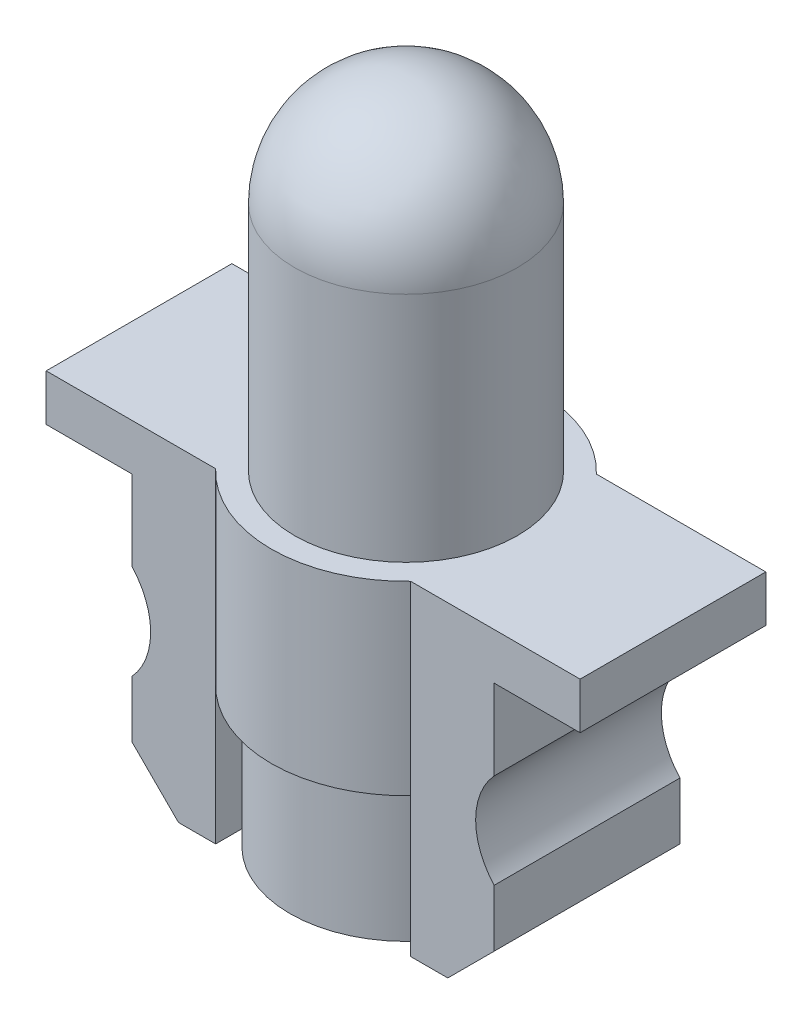
ISO-10303-21;
HEADER;
FILE_DESCRIPTION(('STEP AP214'),'2;1');
FILE_NAME('part.step','',(''),(''),'','','');
FILE_SCHEMA(('AUTOMOTIVE_DESIGN { 1 0 10303 214 1 1 1 1 }'));
ENDSEC;
DATA;
#1=APPLICATION_CONTEXT('core data for automotive mechanical design processes');
#2=APPLICATION_PROTOCOL_DEFINITION('international standard','automotive_design',2000,#1);
#3=PRODUCT_CONTEXT('',#1,'mechanical');
#4=PRODUCT('Part','Part','',(#3));
#5=PRODUCT_RELATED_PRODUCT_CATEGORY('part','',(#4));
#6=PRODUCT_DEFINITION_FORMATION('','',#4);
#7=PRODUCT_DEFINITION_CONTEXT('part definition',#1,'design');
#8=PRODUCT_DEFINITION('design','',#6,#7);
#9=PRODUCT_DEFINITION_SHAPE('','',#8);
#10=(LENGTH_UNIT() NAMED_UNIT(*) SI_UNIT(.MILLI.,.METRE.));
#11=(NAMED_UNIT(*) PLANE_ANGLE_UNIT() SI_UNIT($,.RADIAN.));
#12=(NAMED_UNIT(*) SI_UNIT($,.STERADIAN.) SOLID_ANGLE_UNIT());
#13=UNCERTAINTY_MEASURE_WITH_UNIT(LENGTH_MEASURE(1.E-05),#10,'distance_accuracy_value','');
#14=(GEOMETRIC_REPRESENTATION_CONTEXT(3) GLOBAL_UNCERTAINTY_ASSIGNED_CONTEXT((#13)) GLOBAL_UNIT_ASSIGNED_CONTEXT((#10,
#11,#12)) REPRESENTATION_CONTEXT('',''));
#15=CARTESIAN_POINT('',(0.,0.,0.));
#16=DIRECTION('',(0.,0.,1.));
#17=DIRECTION('',(1.,0.,0.));
#18=AXIS2_PLACEMENT_3D('',#15,#16,#17);
#19=CARTESIAN_POINT('',(3.9,-1.,-8.84105255059483));
#20=DIRECTION('',(1.,0.,0.));
#21=DIRECTION('',(0.,1.,0.));
#22=AXIS2_PLACEMENT_3D('',#19,#20,#21);
#23=PLANE('',#22);
#24=DIRECTION('',(0.,0.,1.));
#25=VECTOR('',#24,1.);
#26=CARTESIAN_POINT('',(3.9,-2.73019609728144,-2.9));
#27=LINE('',#26,#25);
#28=CARTESIAN_POINT('',(3.9,-2.73019609728144,-2.));
#29=VERTEX_POINT('',#28);
#30=CARTESIAN_POINT('',(3.9,-2.73019609728144,2.));
#31=VERTEX_POINT('',#30);
#32=EDGE_CURVE('E329',#29,#31,#27,.T.);
#33=ORIENTED_EDGE('',*,*,#32,.F.);
#34=DIRECTION('',(0.,1.,0.));
#35=VECTOR('',#34,1.);
#36=CARTESIAN_POINT('',(3.9,-1.,-2.));
#37=LINE('',#36,#35);
#38=CARTESIAN_POINT('',(3.9,-1.,-2.));
#39=VERTEX_POINT('',#38);
#40=EDGE_CURVE('E418',#29,#39,#37,.T.);
#41=ORIENTED_EDGE('',*,*,#40,.T.);
#42=DIRECTION('',(0.,0.,1.));
#43=VECTOR('',#42,1.);
#44=CARTESIAN_POINT('',(3.9,-1.,-8.84105255059483));
#45=LINE('',#44,#43);
#46=CARTESIAN_POINT('',(3.9,-1.,2.));
#47=VERTEX_POINT('',#46);
#48=EDGE_CURVE('E227',#39,#47,#45,.T.);
#49=ORIENTED_EDGE('',*,*,#48,.T.);
#50=DIRECTION('',(0.,1.,0.));
#51=VECTOR('',#50,1.);
#52=CARTESIAN_POINT('',(3.9,-1.,2.));
#53=LINE('',#52,#51);
#54=EDGE_CURVE('E419',#31,#47,#53,.T.);
#55=ORIENTED_EDGE('',*,*,#54,.F.);
#56=EDGE_LOOP('',(#33,#41,#49,#55));
#57=FACE_BOUND('',#56,.T.);
#58=ADVANCED_FACE('F36',(#57),#23,.T.);
#59=CARTESIAN_POINT('',(-3.9,-1.,-8.84105255059483));
#60=DIRECTION('',(-1.,0.,0.));
#61=DIRECTION('',(0.,-1.,0.));
#62=AXIS2_PLACEMENT_3D('',#59,#60,#61);
#63=PLANE('',#62);
#64=DIRECTION('',(0.,-1.,0.));
#65=VECTOR('',#64,1.);
#66=CARTESIAN_POINT('',(-3.9,-1.,-2.));
#67=LINE('',#66,#65);
#68=CARTESIAN_POINT('',(-3.9,-4.76980390271856,-2.));
#69=VERTEX_POINT('',#68);
#70=CARTESIAN_POINT('',(-3.9,-6.00000000000001,-2.));
#71=VERTEX_POINT('',#70);
#72=EDGE_CURVE('E244',#69,#71,#67,.T.);
#73=ORIENTED_EDGE('',*,*,#72,.T.);
#74=DIRECTION('',(0.,0.,1.));
#75=VECTOR('',#74,1.);
#76=CARTESIAN_POINT('',(-3.9,-6.,2.));
#77=LINE('',#76,#75);
#78=CARTESIAN_POINT('',(-3.9,-6.00000000000001,2.));
#79=VERTEX_POINT('',#78);
#80=EDGE_CURVE('E342',#71,#79,#77,.T.);
#81=ORIENTED_EDGE('',*,*,#80,.T.);
#82=DIRECTION('',(0.,-1.,0.));
#83=VECTOR('',#82,1.);
#84=CARTESIAN_POINT('',(-3.9,-1.,2.));
#85=LINE('',#84,#83);
#86=CARTESIAN_POINT('',(-3.9,-4.76980390271856,2.));
#87=VERTEX_POINT('',#86);
#88=EDGE_CURVE('E239',#87,#79,#85,.T.);
#89=ORIENTED_EDGE('',*,*,#88,.F.);
#90=DIRECTION('',(0.,0.,1.));
#91=VECTOR('',#90,1.);
#92=CARTESIAN_POINT('',(-3.9,-4.76980390271856,-2.9));
#93=LINE('',#92,#91);
#94=EDGE_CURVE('E324',#69,#87,#93,.T.);
#95=ORIENTED_EDGE('',*,*,#94,.F.);
#96=EDGE_LOOP('',(#73,#81,#89,#95));
#97=FACE_BOUND('',#96,.T.);
#98=ADVANCED_FACE('F357',(#97),#63,.T.);
#99=CARTESIAN_POINT('',(0.,-4.,0.));
#100=DIRECTION('',(0.,1.,0.));
#101=DIRECTION('',(0.,0.,1.));
#102=AXIS2_PLACEMENT_3D('',#99,#100,#101);
#103=PLANE('',#102);
#104=CARTESIAN_POINT('',(0.,-4.,0.));
#105=DIRECTION('',(0.,1.,0.));
#106=DIRECTION('',(0.,0.,1.));
#107=AXIS2_PLACEMENT_3D('',#104,#105,#106);
#108=CIRCLE('',#107,2.9);
#109=CARTESIAN_POINT('',(2.1,-4.,-2.));
#110=VERTEX_POINT('',#109);
#111=CARTESIAN_POINT('',(-2.1,-4.,-2.));
#112=VERTEX_POINT('',#111);
#113=EDGE_CURVE('E265',#110,#112,#108,.T.);
#114=ORIENTED_EDGE('',*,*,#113,.F.);
#115=DIRECTION('',(0.,0.,1.));
#116=VECTOR('',#115,1.);
#117=CARTESIAN_POINT('',(2.1,-4.,0.));
#118=LINE('',#117,#116);
#119=CARTESIAN_POINT('',(2.1,-4.,-1.35646599662505));
#120=VERTEX_POINT('',#119);
#121=EDGE_CURVE('E222',#110,#120,#118,.T.);
#122=ORIENTED_EDGE('',*,*,#121,.T.);
#123=CARTESIAN_POINT('',(0.,-4.,0.));
#124=DIRECTION('',(0.,1.,0.));
#125=DIRECTION('',(0.,0.,1.));
#126=AXIS2_PLACEMENT_3D('',#123,#124,#125);
#127=CIRCLE('',#126,2.5);
#128=CARTESIAN_POINT('',(-2.1,-4.,-1.35646599662506));
#129=VERTEX_POINT('',#128);
#130=EDGE_CURVE('E221',#129,#120,#127,.F.);
#131=ORIENTED_EDGE('',*,*,#130,.F.);
#132=DIRECTION('',(0.,0.,-1.));
#133=VECTOR('',#132,1.);
#134=CARTESIAN_POINT('',(-2.1,-4.,0.));
#135=LINE('',#134,#133);
#136=EDGE_CURVE('E255',#129,#112,#135,.T.);
#137=ORIENTED_EDGE('',*,*,#136,.T.);
#138=EDGE_LOOP('',(#114,#122,#131,#137));
#139=FACE_BOUND('',#138,.T.);
#140=ADVANCED_FACE('F394',(#139),#103,.F.);
#141=CARTESIAN_POINT('',(0.,-4.,0.));
#142=DIRECTION('',(0.,1.,0.));
#143=DIRECTION('',(0.,0.,1.));
#144=AXIS2_PLACEMENT_3D('',#141,#142,#143);
#145=CYLINDRICAL_SURFACE('',#144,2.9);
#146=DIRECTION('',(0.,1.,0.));
#147=VECTOR('',#146,1.);
#148=CARTESIAN_POINT('',(2.1,-4.,-2.));
#149=LINE('',#148,#147);
#150=CARTESIAN_POINT('',(2.1,0.,-2.));
#151=VERTEX_POINT('',#150);
#152=EDGE_CURVE('E277',#151,#110,#149,.F.);
#153=ORIENTED_EDGE('',*,*,#152,.T.);
#154=ORIENTED_EDGE('',*,*,#113,.T.);
#155=DIRECTION('',(0.,1.,0.));
#156=VECTOR('',#155,1.);
#157=CARTESIAN_POINT('',(-2.1,-4.,-2.));
#158=LINE('',#157,#156);
#159=CARTESIAN_POINT('',(-2.1,0.,-2.));
#160=VERTEX_POINT('',#159);
#161=EDGE_CURVE('E271',#112,#160,#158,.T.);
#162=ORIENTED_EDGE('',*,*,#161,.T.);
#163=CARTESIAN_POINT('',(0.,0.,0.));
#164=DIRECTION('',(0.,1.,0.));
#165=DIRECTION('',(0.,0.,1.));
#166=AXIS2_PLACEMENT_3D('',#163,#164,#165);
#167=CIRCLE('',#166,2.9);
#168=EDGE_CURVE('E268',#151,#160,#167,.T.);
#169=ORIENTED_EDGE('',*,*,#168,.F.);
#170=EDGE_LOOP('',(#153,#154,#162,#169));
#171=FACE_BOUND('',#170,.T.);
#172=ADVANCED_FACE('F391',(#171),#145,.T.);
#173=CARTESIAN_POINT('',(0.,-7.6,0.));
#174=DIRECTION('',(0.,1.,0.));
#175=DIRECTION('',(0.,0.,1.));
#176=AXIS2_PLACEMENT_3D('',#173,#174,#175);
#177=CYLINDRICAL_SURFACE('',#176,2.5);
#178=DIRECTION('',(0.,1.,0.));
#179=VECTOR('',#178,1.);
#180=CARTESIAN_POINT('',(-2.1,-7.6,1.35646599662506));
#181=LINE('',#180,#179);
#182=CARTESIAN_POINT('',(-2.1,-4.,1.35646599662506));
#183=VERTEX_POINT('',#182);
#184=CARTESIAN_POINT('',(-2.1,-7.,1.35646599662506));
#185=VERTEX_POINT('',#184);
#186=EDGE_CURVE('E243',#183,#185,#181,.F.);
#187=ORIENTED_EDGE('',*,*,#186,.T.);
#188=CARTESIAN_POINT('',(0.,-7.,0.));
#189=DIRECTION('',(0.,1.,0.));
#190=DIRECTION('',(0.,0.,1.));
#191=AXIS2_PLACEMENT_3D('',#188,#189,#190);
#192=CIRCLE('',#191,2.5);
#193=CARTESIAN_POINT('',(2.1,-7.,1.35646599662505));
#194=VERTEX_POINT('',#193);
#195=EDGE_CURVE('E407',#185,#194,#192,.T.);
#196=ORIENTED_EDGE('',*,*,#195,.T.);
#197=DIRECTION('',(0.,1.,0.));
#198=VECTOR('',#197,1.);
#199=CARTESIAN_POINT('',(2.1,-7.6,1.35646599662505));
#200=LINE('',#199,#198);
#201=CARTESIAN_POINT('',(2.1,-4.,1.35646599662505));
#202=VERTEX_POINT('',#201);
#203=EDGE_CURVE('E224',#194,#202,#200,.T.);
#204=ORIENTED_EDGE('',*,*,#203,.T.);
#205=EDGE_CURVE('E320',#202,#183,#127,.F.);
#206=ORIENTED_EDGE('',*,*,#205,.T.);
#207=EDGE_LOOP('',(#187,#196,#204,#206));
#208=FACE_BOUND('',#207,.T.);
#209=ADVANCED_FACE('F475',(#208),#177,.T.);
#210=ORIENTED_EDGE('',*,*,#205,.F.);
#211=CARTESIAN_POINT('',(2.1,-4.,2.));
#212=VERTEX_POINT('',#211);
#213=EDGE_CURVE('E226',#202,#212,#118,.T.);
#214=ORIENTED_EDGE('',*,*,#213,.T.);
#215=CARTESIAN_POINT('',(-2.1,-4.,2.));
#216=VERTEX_POINT('',#215);
#217=EDGE_CURVE('E261',#216,#212,#108,.T.);
#218=ORIENTED_EDGE('',*,*,#217,.F.);
#219=EDGE_CURVE('E251',#216,#183,#135,.T.);
#220=ORIENTED_EDGE('',*,*,#219,.T.);
#221=EDGE_LOOP('',(#210,#214,#218,#220));
#222=FACE_BOUND('',#221,.T.);
#223=ADVANCED_FACE('F467',(#222),#103,.F.);
#224=CARTESIAN_POINT('',(-5.75,0.,-2.));
#225=DIRECTION('',(0.,-1.,0.));
#226=DIRECTION('',(0.,0.,-1.));
#227=AXIS2_PLACEMENT_3D('',#224,#225,#226);
#228=PLANE('',#227);
#229=DIRECTION('',(1.,0.,0.));
#230=VECTOR('',#229,1.);
#231=CARTESIAN_POINT('',(-5.75,0.,2.));
#232=LINE('',#231,#230);
#233=CARTESIAN_POINT('',(-5.75,0.,2.));
#234=VERTEX_POINT('',#233);
#235=CARTESIAN_POINT('',(-2.1,0.,2.));
#236=VERTEX_POINT('',#235);
#237=EDGE_CURVE('E299',#234,#236,#232,.T.);
#238=ORIENTED_EDGE('',*,*,#237,.T.);
#239=CARTESIAN_POINT('',(2.1,0.,2.));
#240=VERTEX_POINT('',#239);
#241=EDGE_CURVE('E260',#236,#240,#167,.T.);
#242=ORIENTED_EDGE('',*,*,#241,.T.);
#243=CARTESIAN_POINT('',(5.75,0.,2.));
#244=VERTEX_POINT('',#243);
#245=EDGE_CURVE('E298',#240,#244,#232,.T.);
#246=ORIENTED_EDGE('',*,*,#245,.T.);
#247=DIRECTION('',(0.,0.,-1.));
#248=VECTOR('',#247,1.);
#249=CARTESIAN_POINT('',(5.75,0.,2.));
#250=LINE('',#249,#248);
#251=CARTESIAN_POINT('',(5.75,0.,-2.));
#252=VERTEX_POINT('',#251);
#253=EDGE_CURVE('E302',#244,#252,#250,.T.);
#254=ORIENTED_EDGE('',*,*,#253,.T.);
#255=DIRECTION('',(-1.,0.,0.));
#256=VECTOR('',#255,1.);
#257=CARTESIAN_POINT('',(-5.75,0.,-2.));
#258=LINE('',#257,#256);
#259=EDGE_CURVE('E284',#252,#151,#258,.T.);
#260=ORIENTED_EDGE('',*,*,#259,.T.);
#261=ORIENTED_EDGE('',*,*,#168,.T.);
#262=CARTESIAN_POINT('',(-5.75,0.,-2.));
#263=VERTEX_POINT('',#262);
#264=EDGE_CURVE('E305',#160,#263,#258,.T.);
#265=ORIENTED_EDGE('',*,*,#264,.T.);
#266=DIRECTION('',(0.,0.,1.));
#267=VECTOR('',#266,1.);
#268=CARTESIAN_POINT('',(-5.75,0.,2.));
#269=LINE('',#268,#267);
#270=EDGE_CURVE('E279',#263,#234,#269,.T.);
#271=ORIENTED_EDGE('',*,*,#270,.T.);
#272=EDGE_LOOP('',(#238,#242,#246,#254,#260,#261,#265,#271));
#273=FACE_BOUND('',#272,.T.);
#274=CARTESIAN_POINT('',(0.,0.,0.));
#275=DIRECTION('',(0.,-1.,0.));
#276=DIRECTION('',(0.,0.,-1.));
#277=AXIS2_PLACEMENT_3D('',#274,#275,#276);
#278=CIRCLE('',#277,2.4);
#279=CARTESIAN_POINT('',(0.,0.,-2.4));
#280=VERTEX_POINT('',#279);
#281=EDGE_CURVE('E311',#280,#280,#278,.F.);
#282=ORIENTED_EDGE('',*,*,#281,.F.);
#283=EDGE_LOOP('',(#282));
#284=FACE_BOUND('',#283,.T.);
#285=ADVANCED_FACE('F381',(#273,#284),#228,.F.);
#286=CARTESIAN_POINT('',(-5.75,-1.,-2.));
#287=DIRECTION('',(0.,0.,-1.));
#288=DIRECTION('',(-1.,0.,0.));
#289=AXIS2_PLACEMENT_3D('',#286,#287,#288);
#290=PLANE('',#289);
#291=DIRECTION('',(1.,0.,0.));
#292=VECTOR('',#291,1.);
#293=CARTESIAN_POINT('',(-5.75,-7.,-2.));
#294=LINE('',#293,#292);
#295=CARTESIAN_POINT('',(-2.9,-7.,-2.));
#296=VERTEX_POINT('',#295);
#297=CARTESIAN_POINT('',(-2.1,-7.,-2.));
#298=VERTEX_POINT('',#297);
#299=EDGE_CURVE('E398',#296,#298,#294,.T.);
#300=ORIENTED_EDGE('',*,*,#299,.F.);
#301=DIRECTION('',(-0.707106781186549,0.707106781186546,0.));
#302=VECTOR('',#301,1.);
#303=CARTESIAN_POINT('',(-7.32500000000001,-2.57500000000001,-2.));
#304=LINE('',#303,#302);
#305=EDGE_CURVE('E11',#296,#71,#304,.T.);
#306=ORIENTED_EDGE('',*,*,#305,.T.);
#307=ORIENTED_EDGE('',*,*,#72,.F.);
#308=CARTESIAN_POINT('',(-5.,-3.75,-2.));
#309=DIRECTION('',(0.,0.,-1.));
#310=DIRECTION('',(-1.,0.,0.));
#311=AXIS2_PLACEMENT_3D('',#308,#309,#310);
#312=CIRCLE('',#311,1.5);
#313=CARTESIAN_POINT('',(-3.9,-2.73019609728144,-2.));
#314=VERTEX_POINT('',#313);
#315=EDGE_CURVE('E361',#314,#69,#312,.T.);
#316=ORIENTED_EDGE('',*,*,#315,.F.);
#317=CARTESIAN_POINT('',(-3.9,-1.,-2.));
#318=VERTEX_POINT('',#317);
#319=EDGE_CURVE('E240',#318,#314,#67,.T.);
#320=ORIENTED_EDGE('',*,*,#319,.F.);
#321=DIRECTION('',(-1.,0.,0.));
#322=VECTOR('',#321,1.);
#323=CARTESIAN_POINT('',(-5.75,-1.,-2.));
#324=LINE('',#323,#322);
#325=CARTESIAN_POINT('',(-5.75,-1.,-2.));
#326=VERTEX_POINT('',#325);
#327=EDGE_CURVE('E291',#318,#326,#324,.T.);
#328=ORIENTED_EDGE('',*,*,#327,.T.);
#329=DIRECTION('',(0.,1.,0.));
#330=VECTOR('',#329,1.);
#331=CARTESIAN_POINT('',(-5.75,-1.,-2.));
#332=LINE('',#331,#330);
#333=EDGE_CURVE('E308',#326,#263,#332,.T.);
#334=ORIENTED_EDGE('',*,*,#333,.T.);
#335=ORIENTED_EDGE('',*,*,#264,.F.);
#336=ORIENTED_EDGE('',*,*,#161,.F.);
#337=DIRECTION('',(0.,1.,0.));
#338=VECTOR('',#337,1.);
#339=CARTESIAN_POINT('',(-2.1,-1.,-2.));
#340=LINE('',#339,#338);
#341=EDGE_CURVE('E235',#298,#112,#340,.T.);
#342=ORIENTED_EDGE('',*,*,#341,.F.);
#343=EDGE_LOOP('',(#300,#306,#307,#316,#320,#328,#334,#335,#336,#342));
#344=FACE_BOUND('',#343,.T.);
#345=ADVANCED_FACE('F360',(#344),#290,.T.);
#346=CARTESIAN_POINT('',(-5.75,-1.,2.));
#347=DIRECTION('',(0.,0.,1.));
#348=DIRECTION('',(1.,0.,0.));
#349=AXIS2_PLACEMENT_3D('',#346,#347,#348);
#350=PLANE('',#349);
#351=DIRECTION('',(-1.,0.,0.));
#352=VECTOR('',#351,1.);
#353=CARTESIAN_POINT('',(-5.75,-7.,2.));
#354=LINE('',#353,#352);
#355=CARTESIAN_POINT('',(2.9,-7.,2.));
#356=VERTEX_POINT('',#355);
#357=CARTESIAN_POINT('',(2.1,-7.,2.));
#358=VERTEX_POINT('',#357);
#359=EDGE_CURVE('E401',#356,#358,#354,.T.);
#360=ORIENTED_EDGE('',*,*,#359,.F.);
#361=DIRECTION('',(0.707106781186546,0.707106781186549,0.));
#362=VECTOR('',#361,1.);
#363=CARTESIAN_POINT('',(1.57500000000002,-8.32499999999999,2.));
#364=LINE('',#363,#362);
#365=CARTESIAN_POINT('',(3.9,-6.,2.));
#366=VERTEX_POINT('',#365);
#367=EDGE_CURVE('E336',#356,#366,#364,.T.);
#368=ORIENTED_EDGE('',*,*,#367,.T.);
#369=CARTESIAN_POINT('',(3.9,-4.76980390271856,2.));
#370=VERTEX_POINT('',#369);
#371=EDGE_CURVE('E416',#366,#370,#53,.T.);
#372=ORIENTED_EDGE('',*,*,#371,.T.);
#373=CARTESIAN_POINT('',(5.,-3.75,2.));
#374=DIRECTION('',(0.,0.,1.));
#375=DIRECTION('',(1.,0.,0.));
#376=AXIS2_PLACEMENT_3D('',#373,#374,#375);
#377=CIRCLE('',#376,1.5);
#378=EDGE_CURVE('E412',#31,#370,#377,.T.);
#379=ORIENTED_EDGE('',*,*,#378,.F.);
#380=ORIENTED_EDGE('',*,*,#54,.T.);
#381=DIRECTION('',(1.,0.,0.));
#382=VECTOR('',#381,1.);
#383=CARTESIAN_POINT('',(-5.75,-1.,2.));
#384=LINE('',#383,#382);
#385=CARTESIAN_POINT('',(5.75,-1.,2.));
#386=VERTEX_POINT('',#385);
#387=EDGE_CURVE('E283',#47,#386,#384,.T.);
#388=ORIENTED_EDGE('',*,*,#387,.T.);
#389=DIRECTION('',(0.,1.,0.));
#390=VECTOR('',#389,1.);
#391=CARTESIAN_POINT('',(5.75,-1.,2.));
#392=LINE('',#391,#390);
#393=EDGE_CURVE('E314',#386,#244,#392,.T.);
#394=ORIENTED_EDGE('',*,*,#393,.T.);
#395=ORIENTED_EDGE('',*,*,#245,.F.);
#396=DIRECTION('',(0.,1.,0.));
#397=VECTOR('',#396,1.);
#398=CARTESIAN_POINT('',(2.1,-4.,2.));
#399=LINE('',#398,#397);
#400=EDGE_CURVE('E274',#212,#240,#399,.T.);
#401=ORIENTED_EDGE('',*,*,#400,.F.);
#402=DIRECTION('',(0.,-1.,0.));
#403=VECTOR('',#402,1.);
#404=CARTESIAN_POINT('',(2.1,-1.,2.));
#405=LINE('',#404,#403);
#406=EDGE_CURVE('E364',#212,#358,#405,.T.);
#407=ORIENTED_EDGE('',*,*,#406,.T.);
#408=EDGE_LOOP('',(#360,#368,#372,#379,#380,#388,#394,#395,#401,#407));
#409=FACE_BOUND('',#408,.T.);
#410=ADVANCED_FACE('F446',(#409),#350,.T.);
#411=CARTESIAN_POINT('',(-5.75,-1.,-2.));
#412=DIRECTION('',(0.,-1.,0.));
#413=DIRECTION('',(0.,0.,-1.));
#414=AXIS2_PLACEMENT_3D('',#411,#412,#413);
#415=PLANE('',#414);
#416=ORIENTED_EDGE('',*,*,#48,.F.);
#417=CARTESIAN_POINT('',(5.75,-1.,-2.));
#418=VERTEX_POINT('',#417);
#419=EDGE_CURVE('E292',#418,#39,#324,.T.);
#420=ORIENTED_EDGE('',*,*,#419,.F.);
#421=DIRECTION('',(0.,0.,-1.));
#422=VECTOR('',#421,1.);
#423=CARTESIAN_POINT('',(5.75,-1.,2.));
#424=LINE('',#423,#422);
#425=EDGE_CURVE('E288',#386,#418,#424,.T.);
#426=ORIENTED_EDGE('',*,*,#425,.F.);
#427=ORIENTED_EDGE('',*,*,#387,.F.);
#428=EDGE_LOOP('',(#416,#420,#426,#427));
#429=FACE_BOUND('',#428,.T.);
#430=ADVANCED_FACE('F436',(#429),#415,.T.);
#431=CARTESIAN_POINT('',(-5.75,-1.,2.));
#432=DIRECTION('',(-1.,0.,0.));
#433=DIRECTION('',(0.,0.,1.));
#434=AXIS2_PLACEMENT_3D('',#431,#432,#433);
#435=PLANE('',#434);
#436=ORIENTED_EDGE('',*,*,#270,.F.);
#437=ORIENTED_EDGE('',*,*,#333,.F.);
#438=DIRECTION('',(0.,0.,1.));
#439=VECTOR('',#438,1.);
#440=CARTESIAN_POINT('',(-5.75,-1.,2.));
#441=LINE('',#440,#439);
#442=CARTESIAN_POINT('',(-5.75,-1.,2.));
#443=VERTEX_POINT('',#442);
#444=EDGE_CURVE('E280',#326,#443,#441,.T.);
#445=ORIENTED_EDGE('',*,*,#444,.T.);
#446=DIRECTION('',(0.,1.,0.));
#447=VECTOR('',#446,1.);
#448=CARTESIAN_POINT('',(-5.75,-1.,2.));
#449=LINE('',#448,#447);
#450=EDGE_CURVE('E295',#443,#234,#449,.T.);
#451=ORIENTED_EDGE('',*,*,#450,.T.);
#452=EDGE_LOOP('',(#436,#437,#445,#451));
#453=FACE_BOUND('',#452,.T.);
#454=ADVANCED_FACE('F378',(#453),#435,.T.);
#455=CARTESIAN_POINT('',(3.9,-5.99999999999999,-2.));
#456=VERTEX_POINT('',#455);
#457=CARTESIAN_POINT('',(3.9,-4.76980390271856,-2.));
#458=VERTEX_POINT('',#457);
#459=EDGE_CURVE('E421',#456,#458,#37,.T.);
#460=ORIENTED_EDGE('',*,*,#459,.F.);
#461=DIRECTION('',(-0.707106781186546,-0.707106781186549,0.));
#462=VECTOR('',#461,1.);
#463=CARTESIAN_POINT('',(1.57500000000002,-8.32499999999999,-2.));
#464=LINE('',#463,#462);
#465=CARTESIAN_POINT('',(2.9,-7.,-2.));
#466=VERTEX_POINT('',#465);
#467=EDGE_CURVE('E340',#456,#466,#464,.T.);
#468=ORIENTED_EDGE('',*,*,#467,.T.);
#469=DIRECTION('',(1.,0.,0.));
#470=VECTOR('',#469,1.);
#471=CARTESIAN_POINT('',(-5.75,-7.,-2.));
#472=LINE('',#471,#470);
#473=CARTESIAN_POINT('',(2.1,-7.,-2.));
#474=VERTEX_POINT('',#473);
#475=EDGE_CURVE('E207',#474,#466,#472,.T.);
#476=ORIENTED_EDGE('',*,*,#475,.F.);
#477=DIRECTION('',(0.,-1.,0.));
#478=VECTOR('',#477,1.);
#479=CARTESIAN_POINT('',(2.1,-1.,-2.));
#480=LINE('',#479,#478);
#481=EDGE_CURVE('E216',#110,#474,#480,.T.);
#482=ORIENTED_EDGE('',*,*,#481,.F.);
#483=ORIENTED_EDGE('',*,*,#152,.F.);
#484=ORIENTED_EDGE('',*,*,#259,.F.);
#485=DIRECTION('',(0.,1.,0.));
#486=VECTOR('',#485,1.);
#487=CARTESIAN_POINT('',(5.75,-1.,-2.));
#488=LINE('',#487,#486);
#489=EDGE_CURVE('E312',#418,#252,#488,.T.);
#490=ORIENTED_EDGE('',*,*,#489,.F.);
#491=ORIENTED_EDGE('',*,*,#419,.T.);
#492=ORIENTED_EDGE('',*,*,#40,.F.);
#493=CARTESIAN_POINT('',(5.,-3.75,-2.));
#494=DIRECTION('',(0.,0.,-1.));
#495=DIRECTION('',(-1.,0.,0.));
#496=AXIS2_PLACEMENT_3D('',#493,#494,#495);
#497=CIRCLE('',#496,1.5);
#498=EDGE_CURVE('E354',#458,#29,#497,.T.);
#499=ORIENTED_EDGE('',*,*,#498,.F.);
#500=EDGE_LOOP('',(#460,#468,#476,#482,#483,#484,#490,#491,#492,#499));
#501=FACE_BOUND('',#500,.T.);
#502=ADVANCED_FACE('F438',(#501),#290,.T.);
#503=CARTESIAN_POINT('',(5.75,-1.,2.));
#504=DIRECTION('',(1.,0.,0.));
#505=DIRECTION('',(0.,0.,-1.));
#506=AXIS2_PLACEMENT_3D('',#503,#504,#505);
#507=PLANE('',#506);
#508=ORIENTED_EDGE('',*,*,#253,.F.);
#509=ORIENTED_EDGE('',*,*,#393,.F.);
#510=ORIENTED_EDGE('',*,*,#425,.T.);
#511=ORIENTED_EDGE('',*,*,#489,.T.);
#512=EDGE_LOOP('',(#508,#509,#510,#511));
#513=FACE_BOUND('',#512,.T.);
#514=ADVANCED_FACE('F443',(#513),#507,.T.);
#515=ORIENTED_EDGE('',*,*,#88,.T.);
#516=DIRECTION('',(0.707106781186549,-0.707106781186546,0.));
#517=VECTOR('',#516,1.);
#518=CARTESIAN_POINT('',(-7.32500000000001,-2.57500000000001,2.));
#519=LINE('',#518,#517);
#520=CARTESIAN_POINT('',(-2.9,-7.,2.));
#521=VERTEX_POINT('',#520);
#522=EDGE_CURVE('E44',#79,#521,#519,.T.);
#523=ORIENTED_EDGE('',*,*,#522,.T.);
#524=DIRECTION('',(-1.,0.,0.));
#525=VECTOR('',#524,1.);
#526=CARTESIAN_POINT('',(-5.75,-7.,2.));
#527=LINE('',#526,#525);
#528=CARTESIAN_POINT('',(-2.1,-7.,2.));
#529=VERTEX_POINT('',#528);
#530=EDGE_CURVE('E348',#529,#521,#527,.T.);
#531=ORIENTED_EDGE('',*,*,#530,.F.);
#532=DIRECTION('',(0.,1.,0.));
#533=VECTOR('',#532,1.);
#534=CARTESIAN_POINT('',(-2.1,-1.,2.));
#535=LINE('',#534,#533);
#536=EDGE_CURVE('E233',#529,#216,#535,.T.);
#537=ORIENTED_EDGE('',*,*,#536,.T.);
#538=DIRECTION('',(0.,1.,0.));
#539=VECTOR('',#538,1.);
#540=CARTESIAN_POINT('',(-2.1,-4.,2.));
#541=LINE('',#540,#539);
#542=EDGE_CURVE('E264',#236,#216,#541,.F.);
#543=ORIENTED_EDGE('',*,*,#542,.F.);
#544=ORIENTED_EDGE('',*,*,#237,.F.);
#545=ORIENTED_EDGE('',*,*,#450,.F.);
#546=CARTESIAN_POINT('',(-3.9,-1.,2.));
#547=VERTEX_POINT('',#546);
#548=EDGE_CURVE('E285',#443,#547,#384,.T.);
#549=ORIENTED_EDGE('',*,*,#548,.T.);
#550=CARTESIAN_POINT('',(-3.9,-2.73019609728144,2.));
#551=VERTEX_POINT('',#550);
#552=EDGE_CURVE('E236',#547,#551,#85,.T.);
#553=ORIENTED_EDGE('',*,*,#552,.T.);
#554=CARTESIAN_POINT('',(-5.,-3.75,2.));
#555=DIRECTION('',(0.,0.,1.));
#556=DIRECTION('',(1.,0.,0.));
#557=AXIS2_PLACEMENT_3D('',#554,#555,#556);
#558=CIRCLE('',#557,1.5);
#559=EDGE_CURVE('E365',#87,#551,#558,.T.);
#560=ORIENTED_EDGE('',*,*,#559,.F.);
#561=EDGE_LOOP('',(#515,#523,#531,#537,#543,#544,#545,#549,#553,#560));
#562=FACE_BOUND('',#561,.T.);
#563=ADVANCED_FACE('F347',(#562),#350,.T.);
#564=DIRECTION('',(0.,0.,1.));
#565=VECTOR('',#564,1.);
#566=CARTESIAN_POINT('',(-3.9,-1.,-8.84105255059483));
#567=LINE('',#566,#565);
#568=EDGE_CURVE('E246',#318,#547,#567,.T.);
#569=ORIENTED_EDGE('',*,*,#568,.T.);
#570=ORIENTED_EDGE('',*,*,#548,.F.);
#571=ORIENTED_EDGE('',*,*,#444,.F.);
#572=ORIENTED_EDGE('',*,*,#327,.F.);
#573=EDGE_LOOP('',(#569,#570,#571,#572));
#574=FACE_BOUND('',#573,.T.);
#575=ADVANCED_FACE('F374',(#574),#415,.T.);
#576=ORIENTED_EDGE('',*,*,#217,.T.);
#577=ORIENTED_EDGE('',*,*,#400,.T.);
#578=ORIENTED_EDGE('',*,*,#241,.F.);
#579=ORIENTED_EDGE('',*,*,#542,.T.);
#580=EDGE_LOOP('',(#576,#577,#578,#579));
#581=FACE_BOUND('',#580,.T.);
#582=ADVANCED_FACE('F469',(#581),#145,.T.);
#583=CARTESIAN_POINT('',(0.,7.94580611308462,0.));
#584=DIRECTION('',(0.,1.,0.));
#585=DIRECTION('',(0.,0.,1.));
#586=AXIS2_PLACEMENT_3D('',#583,#584,#585);
#587=CYLINDRICAL_SURFACE('',#586,2.4);
#588=CARTESIAN_POINT('',(0.,5.,0.));
#589=DIRECTION('',(0.,1.,0.));
#590=DIRECTION('',(0.,0.,1.));
#591=AXIS2_PLACEMENT_3D('',#588,#589,#590);
#592=CIRCLE('',#591,2.4);
#593=CARTESIAN_POINT('',(0.,5.,2.4));
#594=VERTEX_POINT('',#593);
#595=EDGE_CURVE('E257',#594,#594,#592,.T.);
#596=ORIENTED_EDGE('',*,*,#595,.F.);
#597=EDGE_LOOP('',(#596));
#598=FACE_BOUND('',#597,.T.);
#599=ORIENTED_EDGE('',*,*,#281,.T.);
#600=EDGE_LOOP('',(#599));
#601=FACE_BOUND('',#600,.T.);
#602=ADVANCED_FACE('F528',(#598,#601),#587,.T.);
#603=CARTESIAN_POINT('',(0.,5.,0.));
#604=DIRECTION('',(0.,1.,0.));
#605=DIRECTION('',(1.,0.,0.));
#606=AXIS2_PLACEMENT_3D('',#603,#604,#605);
#607=SPHERICAL_SURFACE('',#606,2.4);
#608=ORIENTED_EDGE('',*,*,#595,.T.);
#609=EDGE_LOOP('',(#608));
#610=FACE_BOUND('',#609,.T.);
#611=ADVANCED_FACE('F487',(#610),#607,.T.);
#612=DIRECTION('',(0.,1.,0.));
#613=VECTOR('',#612,1.);
#614=CARTESIAN_POINT('',(2.1,-7.6,-1.35646599662505));
#615=LINE('',#614,#613);
#616=CARTESIAN_POINT('',(2.1,-7.,-1.35646599662505));
#617=VERTEX_POINT('',#616);
#618=EDGE_CURVE('E213',#120,#617,#615,.F.);
#619=ORIENTED_EDGE('',*,*,#618,.T.);
#620=CARTESIAN_POINT('',(0.,-7.,0.));
#621=DIRECTION('',(0.,1.,0.));
#622=DIRECTION('',(0.,0.,1.));
#623=AXIS2_PLACEMENT_3D('',#620,#621,#622);
#624=CIRCLE('',#623,2.5);
#625=CARTESIAN_POINT('',(-2.1,-7.,-1.35646599662506));
#626=VERTEX_POINT('',#625);
#627=EDGE_CURVE('E196',#617,#626,#624,.T.);
#628=ORIENTED_EDGE('',*,*,#627,.T.);
#629=DIRECTION('',(0.,1.,0.));
#630=VECTOR('',#629,1.);
#631=CARTESIAN_POINT('',(-2.1,-7.6,-1.35646599662506));
#632=LINE('',#631,#630);
#633=EDGE_CURVE('E254',#626,#129,#632,.T.);
#634=ORIENTED_EDGE('',*,*,#633,.T.);
#635=ORIENTED_EDGE('',*,*,#130,.T.);
#636=EDGE_LOOP('',(#619,#628,#634,#635));
#637=FACE_BOUND('',#636,.T.);
#638=ADVANCED_FACE('F219',(#637),#177,.T.);
#639=CARTESIAN_POINT('',(-2.1,-1.,-8.84105255059483));
#640=DIRECTION('',(1.,0.,0.));
#641=DIRECTION('',(0.,1.,0.));
#642=AXIS2_PLACEMENT_3D('',#639,#640,#641);
#643=PLANE('',#642);
#644=DIRECTION('',(0.,0.,1.));
#645=VECTOR('',#644,1.);
#646=CARTESIAN_POINT('',(-2.1,-7.,-8.84105255059483));
#647=LINE('',#646,#645);
#648=EDGE_CURVE('E203',#298,#626,#647,.T.);
#649=ORIENTED_EDGE('',*,*,#648,.F.);
#650=ORIENTED_EDGE('',*,*,#341,.T.);
#651=ORIENTED_EDGE('',*,*,#136,.F.);
#652=ORIENTED_EDGE('',*,*,#633,.F.);
#653=EDGE_LOOP('',(#649,#650,#651,#652));
#654=FACE_BOUND('',#653,.T.);
#655=ADVANCED_FACE('F397',(#654),#643,.T.);
#656=DIRECTION('',(0.,0.,1.));
#657=VECTOR('',#656,1.);
#658=CARTESIAN_POINT('',(-2.1,-7.,-8.84105255059483));
#659=LINE('',#658,#657);
#660=EDGE_CURVE('E353',#185,#529,#659,.T.);
#661=ORIENTED_EDGE('',*,*,#660,.F.);
#662=ORIENTED_EDGE('',*,*,#186,.F.);
#663=ORIENTED_EDGE('',*,*,#219,.F.);
#664=ORIENTED_EDGE('',*,*,#536,.F.);
#665=EDGE_LOOP('',(#661,#662,#663,#664));
#666=FACE_BOUND('',#665,.T.);
#667=ADVANCED_FACE('F473',(#666),#643,.T.);
#668=DIRECTION('',(0.,0.,1.));
#669=VECTOR('',#668,1.);
#670=CARTESIAN_POINT('',(-3.9,-2.73019609728144,-2.9));
#671=LINE('',#670,#669);
#672=EDGE_CURVE('E322',#551,#314,#671,.F.);
#673=ORIENTED_EDGE('',*,*,#672,.F.);
#674=ORIENTED_EDGE('',*,*,#552,.F.);
#675=ORIENTED_EDGE('',*,*,#568,.F.);
#676=ORIENTED_EDGE('',*,*,#319,.T.);
#677=EDGE_LOOP('',(#673,#674,#675,#676));
#678=FACE_BOUND('',#677,.T.);
#679=ADVANCED_FACE('F369',(#678),#63,.T.);
#680=CARTESIAN_POINT('',(2.1,-1.,-8.84105255059483));
#681=DIRECTION('',(-1.,0.,0.));
#682=DIRECTION('',(0.,0.,1.));
#683=AXIS2_PLACEMENT_3D('',#680,#681,#682);
#684=PLANE('',#683);
#685=DIRECTION('',(0.,0.,-1.));
#686=VECTOR('',#685,1.);
#687=CARTESIAN_POINT('',(2.1,-7.,-8.84105255059483));
#688=LINE('',#687,#686);
#689=EDGE_CURVE('E399',#358,#194,#688,.T.);
#690=ORIENTED_EDGE('',*,*,#689,.F.);
#691=ORIENTED_EDGE('',*,*,#406,.F.);
#692=ORIENTED_EDGE('',*,*,#213,.F.);
#693=ORIENTED_EDGE('',*,*,#203,.F.);
#694=EDGE_LOOP('',(#690,#691,#692,#693));
#695=FACE_BOUND('',#694,.T.);
#696=ADVANCED_FACE('F462',(#695),#684,.T.);
#697=DIRECTION('',(0.,0.,-1.));
#698=VECTOR('',#697,1.);
#699=CARTESIAN_POINT('',(2.1,-7.,-8.84105255059483));
#700=LINE('',#699,#698);
#701=EDGE_CURVE('E200',#617,#474,#700,.T.);
#702=ORIENTED_EDGE('',*,*,#701,.F.);
#703=ORIENTED_EDGE('',*,*,#618,.F.);
#704=ORIENTED_EDGE('',*,*,#121,.F.);
#705=ORIENTED_EDGE('',*,*,#481,.T.);
#706=EDGE_LOOP('',(#702,#703,#704,#705));
#707=FACE_BOUND('',#706,.T.);
#708=ADVANCED_FACE('F211',(#707),#684,.T.);
#709=ORIENTED_EDGE('',*,*,#371,.F.);
#710=DIRECTION('',(0.,0.,-1.));
#711=VECTOR('',#710,1.);
#712=CARTESIAN_POINT('',(3.9,-6.,-2.));
#713=LINE('',#712,#711);
#714=EDGE_CURVE('E338',#366,#456,#713,.T.);
#715=ORIENTED_EDGE('',*,*,#714,.T.);
#716=ORIENTED_EDGE('',*,*,#459,.T.);
#717=DIRECTION('',(0.,0.,1.));
#718=VECTOR('',#717,1.);
#719=CARTESIAN_POINT('',(3.9,-4.76980390271856,-2.9));
#720=LINE('',#719,#718);
#721=EDGE_CURVE('E326',#370,#458,#720,.F.);
#722=ORIENTED_EDGE('',*,*,#721,.F.);
#723=EDGE_LOOP('',(#709,#715,#716,#722));
#724=FACE_BOUND('',#723,.T.);
#725=ADVANCED_FACE('F451',(#724),#23,.T.);
#726=CARTESIAN_POINT('',(-5.,-3.75,-2.9));
#727=DIRECTION('',(0.,0.,1.));
#728=DIRECTION('',(1.,0.,0.));
#729=AXIS2_PLACEMENT_3D('',#726,#727,#728);
#730=CYLINDRICAL_SURFACE('',#729,1.5);
#731=ORIENTED_EDGE('',*,*,#94,.T.);
#732=ORIENTED_EDGE('',*,*,#559,.T.);
#733=ORIENTED_EDGE('',*,*,#672,.T.);
#734=ORIENTED_EDGE('',*,*,#315,.T.);
#735=EDGE_LOOP('',(#731,#732,#733,#734));
#736=FACE_BOUND('',#735,.T.);
#737=ADVANCED_FACE('F496',(#736),#730,.F.);
#738=CARTESIAN_POINT('',(5.,-3.75,-2.9));
#739=DIRECTION('',(0.,0.,1.));
#740=DIRECTION('',(1.,0.,0.));
#741=AXIS2_PLACEMENT_3D('',#738,#739,#740);
#742=CYLINDRICAL_SURFACE('',#741,1.5);
#743=ORIENTED_EDGE('',*,*,#32,.T.);
#744=ORIENTED_EDGE('',*,*,#378,.T.);
#745=ORIENTED_EDGE('',*,*,#721,.T.);
#746=ORIENTED_EDGE('',*,*,#498,.T.);
#747=EDGE_LOOP('',(#743,#744,#745,#746));
#748=FACE_BOUND('',#747,.T.);
#749=ADVANCED_FACE('F450',(#748),#742,.F.);
#750=CARTESIAN_POINT('',(-3.9,-7.,-2.9));
#751=DIRECTION('',(0.,1.,0.));
#752=DIRECTION('',(0.,0.,1.));
#753=AXIS2_PLACEMENT_3D('',#750,#751,#752);
#754=PLANE('',#753);
#755=ORIENTED_EDGE('',*,*,#475,.T.);
#756=DIRECTION('',(0.,0.,1.));
#757=VECTOR('',#756,1.);
#758=CARTESIAN_POINT('',(2.9,-7.,2.));
#759=LINE('',#758,#757);
#760=EDGE_CURVE('E333',#466,#356,#759,.T.);
#761=ORIENTED_EDGE('',*,*,#760,.T.);
#762=ORIENTED_EDGE('',*,*,#359,.T.);
#763=ORIENTED_EDGE('',*,*,#689,.T.);
#764=ORIENTED_EDGE('',*,*,#195,.F.);
#765=ORIENTED_EDGE('',*,*,#660,.T.);
#766=ORIENTED_EDGE('',*,*,#530,.T.);
#767=DIRECTION('',(0.,0.,-1.));
#768=VECTOR('',#767,1.);
#769=CARTESIAN_POINT('',(-2.9,-7.,-2.));
#770=LINE('',#769,#768);
#771=EDGE_CURVE('E331',#521,#296,#770,.T.);
#772=ORIENTED_EDGE('',*,*,#771,.T.);
#773=ORIENTED_EDGE('',*,*,#299,.T.);
#774=ORIENTED_EDGE('',*,*,#648,.T.);
#775=ORIENTED_EDGE('',*,*,#627,.F.);
#776=ORIENTED_EDGE('',*,*,#701,.T.);
#777=EDGE_LOOP('',(#755,#761,#762,#763,#764,#765,#766,#772,#773,#774,#775,#776));
#778=FACE_BOUND('',#777,.T.);
#779=ADVANCED_FACE('F199',(#778),#754,.F.);
#780=CARTESIAN_POINT('',(2.9,-7.,-2.9));
#781=DIRECTION('',(0.707106781186549,-0.707106781186546,0.));
#782=DIRECTION('',(0.,0.,-1.));
#783=AXIS2_PLACEMENT_3D('',#780,#781,#782);
#784=PLANE('',#783);
#785=ORIENTED_EDGE('',*,*,#467,.F.);
#786=ORIENTED_EDGE('',*,*,#714,.F.);
#787=ORIENTED_EDGE('',*,*,#367,.F.);
#788=ORIENTED_EDGE('',*,*,#760,.F.);
#789=EDGE_LOOP('',(#785,#786,#787,#788));
#790=FACE_BOUND('',#789,.T.);
#791=ADVANCED_FACE('F455',(#790),#784,.T.);
#792=CARTESIAN_POINT('',(-3.9,-6.,-8.84105255059483));
#793=DIRECTION('',(-0.707106781186546,-0.707106781186549,0.));
#794=DIRECTION('',(0.,0.,-1.));
#795=AXIS2_PLACEMENT_3D('',#792,#793,#794);
#796=PLANE('',#795);
#797=ORIENTED_EDGE('',*,*,#305,.F.);
#798=ORIENTED_EDGE('',*,*,#771,.F.);
#799=ORIENTED_EDGE('',*,*,#522,.F.);
#800=ORIENTED_EDGE('',*,*,#80,.F.);
#801=EDGE_LOOP('',(#797,#798,#799,#800));
#802=FACE_BOUND('',#801,.T.);
#803=ADVANCED_FACE('F38',(#802),#796,.T.);
#804=CLOSED_SHELL('',(#58,#98,#140,#172,#209,#223,#285,#345,#410,#430,#454,#502,#514,#563,#575,
#582,#602,#611,#638,#655,#667,#679,#696,#708,#725,#737,#749,#779,#791,#803));
#805=MANIFOLD_SOLID_BREP('B2',#804);
#806=ADVANCED_BREP_SHAPE_REPRESENTATION('',(#18,#805),#14);
#807=SHAPE_DEFINITION_REPRESENTATION(#9,#806);
ENDSEC;
END-ISO-10303-21;
